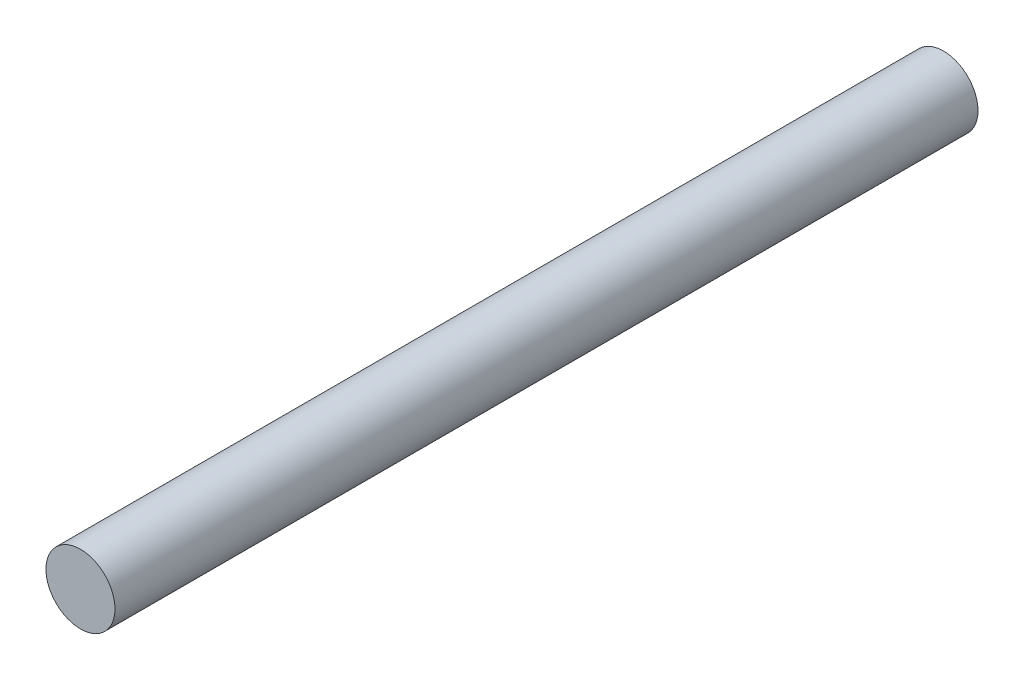
ISO-10303-21;
HEADER;
FILE_DESCRIPTION(('STEP AP214'),'2;1');
FILE_NAME('part.step','',(''),(''),'','','');
FILE_SCHEMA(('AUTOMOTIVE_DESIGN { 1 0 10303 214 1 1 1 1 }'));
ENDSEC;
DATA;
#1=APPLICATION_CONTEXT('core data for automotive mechanical design processes');
#2=APPLICATION_PROTOCOL_DEFINITION('international standard','automotive_design',2000,#1);
#3=PRODUCT_CONTEXT('',#1,'mechanical');
#4=PRODUCT('Part','Part','',(#3));
#5=PRODUCT_RELATED_PRODUCT_CATEGORY('part','',(#4));
#6=PRODUCT_DEFINITION_FORMATION('','',#4);
#7=PRODUCT_DEFINITION_CONTEXT('part definition',#1,'design');
#8=PRODUCT_DEFINITION('design','',#6,#7);
#9=PRODUCT_DEFINITION_SHAPE('','',#8);
#10=(LENGTH_UNIT() NAMED_UNIT(*) SI_UNIT(.MILLI.,.METRE.));
#11=(NAMED_UNIT(*) PLANE_ANGLE_UNIT() SI_UNIT($,.RADIAN.));
#12=(NAMED_UNIT(*) SI_UNIT($,.STERADIAN.) SOLID_ANGLE_UNIT());
#13=UNCERTAINTY_MEASURE_WITH_UNIT(LENGTH_MEASURE(1.E-05),#10,'distance_accuracy_value','');
#14=(GEOMETRIC_REPRESENTATION_CONTEXT(3) GLOBAL_UNCERTAINTY_ASSIGNED_CONTEXT((#13)) GLOBAL_UNIT_ASSIGNED_CONTEXT((#10,
#11,#12)) REPRESENTATION_CONTEXT('',''));
#15=CARTESIAN_POINT('',(0.,0.,0.));
#16=DIRECTION('',(0.,0.,1.));
#17=DIRECTION('',(1.,0.,0.));
#18=AXIS2_PLACEMENT_3D('',#15,#16,#17);
#19=CARTESIAN_POINT('',(0.,0.,100.));
#20=DIRECTION('',(0.,0.,-1.));
#21=DIRECTION('',(-1.,0.,0.));
#22=AXIS2_PLACEMENT_3D('',#19,#20,#21);
#23=CYLINDRICAL_SURFACE('',#22,4.);
#24=CARTESIAN_POINT('',(0.,0.,100.));
#25=DIRECTION('',(0.,0.,1.));
#26=DIRECTION('',(1.,0.,0.));
#27=AXIS2_PLACEMENT_3D('',#24,#25,#26);
#28=CIRCLE('',#27,4.);
#29=CARTESIAN_POINT('',(4.,0.,100.));
#30=VERTEX_POINT('',#29);
#31=EDGE_CURVE('E10',#30,#30,#28,.T.);
#32=ORIENTED_EDGE('',*,*,#31,.F.);
#33=EDGE_LOOP('',(#32));
#34=FACE_BOUND('',#33,.T.);
#35=CARTESIAN_POINT('',(0.,0.,0.));
#36=DIRECTION('',(0.,0.,1.));
#37=DIRECTION('',(1.,0.,0.));
#38=AXIS2_PLACEMENT_3D('',#35,#36,#37);
#39=CIRCLE('',#38,4.);
#40=CARTESIAN_POINT('',(4.,0.,0.));
#41=VERTEX_POINT('',#40);
#42=EDGE_CURVE('E37',#41,#41,#39,.T.);
#43=ORIENTED_EDGE('',*,*,#42,.T.);
#44=EDGE_LOOP('',(#43));
#45=FACE_BOUND('',#44,.T.);
#46=ADVANCED_FACE('F34',(#34,#45),#23,.T.);
#47=CARTESIAN_POINT('',(0.,0.,100.));
#48=DIRECTION('',(0.,0.,1.));
#49=DIRECTION('',(1.,0.,0.));
#50=AXIS2_PLACEMENT_3D('',#47,#48,#49);
#51=PLANE('',#50);
#52=ORIENTED_EDGE('',*,*,#31,.T.);
#53=EDGE_LOOP('',(#52));
#54=FACE_BOUND('',#53,.T.);
#55=ADVANCED_FACE('F49',(#54),#51,.T.);
#56=CARTESIAN_POINT('',(0.,0.,0.));
#57=DIRECTION('',(0.,0.,1.));
#58=DIRECTION('',(1.,0.,0.));
#59=AXIS2_PLACEMENT_3D('',#56,#57,#58);
#60=PLANE('',#59);
#61=ORIENTED_EDGE('',*,*,#42,.F.);
#62=EDGE_LOOP('',(#61));
#63=FACE_BOUND('',#62,.T.);
#64=ADVANCED_FACE('F47',(#63),#60,.F.);
#65=CLOSED_SHELL('',(#46,#55,#64));
#66=MANIFOLD_SOLID_BREP('B2',#65);
#67=ADVANCED_BREP_SHAPE_REPRESENTATION('',(#18,#66),#14);
#68=SHAPE_DEFINITION_REPRESENTATION(#9,#67);
ENDSEC;
END-ISO-10303-21;
